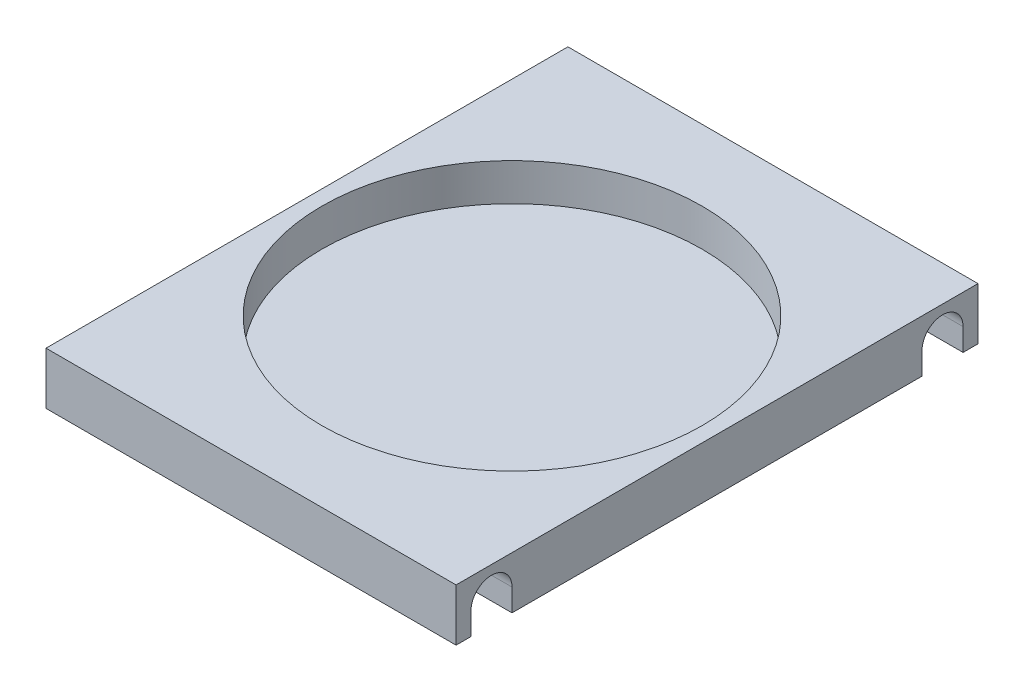
ISO-10303-21;
HEADER;
FILE_DESCRIPTION(('STEP AP214'),'2;1');
FILE_NAME('part.step','',(''),(''),'','','');
FILE_SCHEMA(('AUTOMOTIVE_DESIGN { 1 0 10303 214 1 1 1 1 }'));
ENDSEC;
DATA;
#1=APPLICATION_CONTEXT('core data for automotive mechanical design processes');
#2=APPLICATION_PROTOCOL_DEFINITION('international standard','automotive_design',2000,#1);
#3=PRODUCT_CONTEXT('',#1,'mechanical');
#4=PRODUCT('Part','Part','',(#3));
#5=PRODUCT_RELATED_PRODUCT_CATEGORY('part','',(#4));
#6=PRODUCT_DEFINITION_FORMATION('','',#4);
#7=PRODUCT_DEFINITION_CONTEXT('part definition',#1,'design');
#8=PRODUCT_DEFINITION('design','',#6,#7);
#9=PRODUCT_DEFINITION_SHAPE('','',#8);
#10=(LENGTH_UNIT() NAMED_UNIT(*) SI_UNIT(.MILLI.,.METRE.));
#11=(NAMED_UNIT(*) PLANE_ANGLE_UNIT() SI_UNIT($,.RADIAN.));
#12=(NAMED_UNIT(*) SI_UNIT($,.STERADIAN.) SOLID_ANGLE_UNIT());
#13=UNCERTAINTY_MEASURE_WITH_UNIT(LENGTH_MEASURE(1.E-05),#10,'distance_accuracy_value','');
#14=(GEOMETRIC_REPRESENTATION_CONTEXT(3) GLOBAL_UNCERTAINTY_ASSIGNED_CONTEXT((#13)) GLOBAL_UNIT_ASSIGNED_CONTEXT((#10,
#11,#12)) REPRESENTATION_CONTEXT('',''));
#15=CARTESIAN_POINT('',(0.,0.,0.));
#16=DIRECTION('',(0.,0.,1.));
#17=DIRECTION('',(1.,0.,0.));
#18=AXIS2_PLACEMENT_3D('',#15,#16,#17);
#19=CARTESIAN_POINT('',(27.5,8.,-35.));
#20=DIRECTION('',(-1.,0.,0.));
#21=DIRECTION('',(0.,0.,1.));
#22=AXIS2_PLACEMENT_3D('',#19,#20,#21);
#23=PLANE('',#22);
#24=DIRECTION('',(0.,-1.,0.));
#25=VECTOR('',#24,1.);
#26=CARTESIAN_POINT('',(27.5,8.,35.));
#27=LINE('',#26,#25);
#28=CARTESIAN_POINT('',(27.5,8.,35.));
#29=VERTEX_POINT('',#28);
#30=CARTESIAN_POINT('',(27.5,1.,35.));
#31=VERTEX_POINT('',#30);
#32=EDGE_CURVE('E240',#29,#31,#27,.T.);
#33=ORIENTED_EDGE('',*,*,#32,.T.);
#34=DIRECTION('',(0.,0.,1.));
#35=VECTOR('',#34,1.);
#36=CARTESIAN_POINT('',(27.5,1.,35.));
#37=LINE('',#36,#35);
#38=CARTESIAN_POINT('',(27.5,1.,33.));
#39=VERTEX_POINT('',#38);
#40=EDGE_CURVE('E152',#39,#31,#37,.T.);
#41=ORIENTED_EDGE('',*,*,#40,.F.);
#42=DIRECTION('',(0.,-1.,0.));
#43=VECTOR('',#42,1.);
#44=CARTESIAN_POINT('',(27.5,0.,33.));
#45=LINE('',#44,#43);
#46=CARTESIAN_POINT('',(27.5,4.,33.));
#47=VERTEX_POINT('',#46);
#48=EDGE_CURVE('E203',#47,#39,#45,.T.);
#49=ORIENTED_EDGE('',*,*,#48,.F.);
#50=CARTESIAN_POINT('',(27.5,4.,30.25));
#51=DIRECTION('',(1.,0.,0.));
#52=DIRECTION('',(0.,0.,-1.));
#53=AXIS2_PLACEMENT_3D('',#50,#51,#52);
#54=CIRCLE('',#53,2.75);
#55=CARTESIAN_POINT('',(27.5,4.,27.5));
#56=VERTEX_POINT('',#55);
#57=EDGE_CURVE('E199',#56,#47,#54,.T.);
#58=ORIENTED_EDGE('',*,*,#57,.F.);
#59=DIRECTION('',(0.,-1.,0.));
#60=VECTOR('',#59,1.);
#61=CARTESIAN_POINT('',(27.5,0.,27.5));
#62=LINE('',#61,#60);
#63=CARTESIAN_POINT('',(27.5,1.,27.5));
#64=VERTEX_POINT('',#63);
#65=EDGE_CURVE('E192',#56,#64,#62,.T.);
#66=ORIENTED_EDGE('',*,*,#65,.T.);
#67=CARTESIAN_POINT('',(27.5,1.,-27.5));
#68=VERTEX_POINT('',#67);
#69=EDGE_CURVE('E150',#68,#64,#37,.T.);
#70=ORIENTED_EDGE('',*,*,#69,.F.);
#71=DIRECTION('',(0.,-1.,0.));
#72=VECTOR('',#71,1.);
#73=CARTESIAN_POINT('',(27.5,0.,-27.5));
#74=LINE('',#73,#72);
#75=CARTESIAN_POINT('',(27.5,4.,-27.5));
#76=VERTEX_POINT('',#75);
#77=EDGE_CURVE('E252',#76,#68,#74,.T.);
#78=ORIENTED_EDGE('',*,*,#77,.F.);
#79=CARTESIAN_POINT('',(27.5,4.,-30.25));
#80=DIRECTION('',(-1.,0.,0.));
#81=DIRECTION('',(0.,0.,1.));
#82=AXIS2_PLACEMENT_3D('',#79,#80,#81);
#83=CIRCLE('',#82,2.75);
#84=CARTESIAN_POINT('',(27.5,4.,-33.));
#85=VERTEX_POINT('',#84);
#86=EDGE_CURVE('E184',#76,#85,#83,.T.);
#87=ORIENTED_EDGE('',*,*,#86,.T.);
#88=DIRECTION('',(0.,-1.,0.));
#89=VECTOR('',#88,1.);
#90=CARTESIAN_POINT('',(27.5,0.,-33.));
#91=LINE('',#90,#89);
#92=CARTESIAN_POINT('',(27.5,1.,-33.));
#93=VERTEX_POINT('',#92);
#94=EDGE_CURVE('E148',#85,#93,#91,.T.);
#95=ORIENTED_EDGE('',*,*,#94,.T.);
#96=CARTESIAN_POINT('',(27.5,1.,-35.));
#97=VERTEX_POINT('',#96);
#98=EDGE_CURVE('E129',#97,#93,#37,.T.);
#99=ORIENTED_EDGE('',*,*,#98,.F.);
#100=DIRECTION('',(0.,-1.,0.));
#101=VECTOR('',#100,1.);
#102=CARTESIAN_POINT('',(27.5,8.,-35.));
#103=LINE('',#102,#101);
#104=CARTESIAN_POINT('',(27.5,8.,-35.));
#105=VERTEX_POINT('',#104);
#106=EDGE_CURVE('E145',#105,#97,#103,.T.);
#107=ORIENTED_EDGE('',*,*,#106,.F.);
#108=DIRECTION('',(0.,0.,-1.));
#109=VECTOR('',#108,1.);
#110=CARTESIAN_POINT('',(27.5,8.,-35.));
#111=LINE('',#110,#109);
#112=EDGE_CURVE('E226',#29,#105,#111,.T.);
#113=ORIENTED_EDGE('',*,*,#112,.F.);
#114=EDGE_LOOP('',(#33,#41,#49,#58,#66,#70,#78,#87,#95,#99,#107,#113));
#115=FACE_BOUND('',#114,.T.);
#116=ADVANCED_FACE('F39',(#115),#23,.F.);
#117=CARTESIAN_POINT('',(-27.5,8.,-35.));
#118=DIRECTION('',(1.,0.,0.));
#119=DIRECTION('',(0.,0.,-1.));
#120=AXIS2_PLACEMENT_3D('',#117,#118,#119);
#121=PLANE('',#120);
#122=DIRECTION('',(0.,-1.,0.));
#123=VECTOR('',#122,1.);
#124=CARTESIAN_POINT('',(-27.5,8.,-35.));
#125=LINE('',#124,#123);
#126=CARTESIAN_POINT('',(-27.5,8.,-35.));
#127=VERTEX_POINT('',#126);
#128=CARTESIAN_POINT('',(-27.5,1.,-35.));
#129=VERTEX_POINT('',#128);
#130=EDGE_CURVE('E158',#127,#129,#125,.T.);
#131=ORIENTED_EDGE('',*,*,#130,.T.);
#132=DIRECTION('',(0.,0.,1.));
#133=VECTOR('',#132,1.);
#134=CARTESIAN_POINT('',(-27.5,1.,-35.));
#135=LINE('',#134,#133);
#136=CARTESIAN_POINT('',(-27.5,1.,-33.));
#137=VERTEX_POINT('',#136);
#138=EDGE_CURVE('E132',#129,#137,#135,.T.);
#139=ORIENTED_EDGE('',*,*,#138,.T.);
#140=DIRECTION('',(0.,-1.,0.));
#141=VECTOR('',#140,1.);
#142=CARTESIAN_POINT('',(-27.5,8.,-33.));
#143=LINE('',#142,#141);
#144=CARTESIAN_POINT('',(-27.5,4.,-33.));
#145=VERTEX_POINT('',#144);
#146=EDGE_CURVE('E182',#145,#137,#143,.T.);
#147=ORIENTED_EDGE('',*,*,#146,.F.);
#148=CARTESIAN_POINT('',(-27.5,4.,-30.25));
#149=DIRECTION('',(1.,0.,0.));
#150=DIRECTION('',(0.,0.,-1.));
#151=AXIS2_PLACEMENT_3D('',#148,#149,#150);
#152=CIRCLE('',#151,2.75);
#153=CARTESIAN_POINT('',(-27.5,4.,-27.5));
#154=VERTEX_POINT('',#153);
#155=EDGE_CURVE('E47',#154,#145,#152,.F.);
#156=ORIENTED_EDGE('',*,*,#155,.F.);
#157=DIRECTION('',(0.,-1.,0.));
#158=VECTOR('',#157,1.);
#159=CARTESIAN_POINT('',(-27.5,8.,-27.5));
#160=LINE('',#159,#158);
#161=CARTESIAN_POINT('',(-27.5,1.,-27.5));
#162=VERTEX_POINT('',#161);
#163=EDGE_CURVE('E188',#154,#162,#160,.T.);
#164=ORIENTED_EDGE('',*,*,#163,.T.);
#165=CARTESIAN_POINT('',(-27.5,1.,27.5));
#166=VERTEX_POINT('',#165);
#167=EDGE_CURVE('E62',#162,#166,#135,.T.);
#168=ORIENTED_EDGE('',*,*,#167,.T.);
#169=DIRECTION('',(0.,-1.,0.));
#170=VECTOR('',#169,1.);
#171=CARTESIAN_POINT('',(-27.5,8.,27.5));
#172=LINE('',#171,#170);
#173=CARTESIAN_POINT('',(-27.5,4.,27.5));
#174=VERTEX_POINT('',#173);
#175=EDGE_CURVE('E217',#174,#166,#172,.T.);
#176=ORIENTED_EDGE('',*,*,#175,.F.);
#177=CARTESIAN_POINT('',(-27.5,4.,30.25));
#178=DIRECTION('',(1.,0.,0.));
#179=DIRECTION('',(0.,0.,-1.));
#180=AXIS2_PLACEMENT_3D('',#177,#178,#179);
#181=CIRCLE('',#180,2.75);
#182=CARTESIAN_POINT('',(-27.5,4.,33.));
#183=VERTEX_POINT('',#182);
#184=EDGE_CURVE('E157',#174,#183,#181,.T.);
#185=ORIENTED_EDGE('',*,*,#184,.T.);
#186=DIRECTION('',(0.,-1.,0.));
#187=VECTOR('',#186,1.);
#188=CARTESIAN_POINT('',(-27.5,8.,33.));
#189=LINE('',#188,#187);
#190=CARTESIAN_POINT('',(-27.5,1.,33.));
#191=VERTEX_POINT('',#190);
#192=EDGE_CURVE('E211',#183,#191,#189,.T.);
#193=ORIENTED_EDGE('',*,*,#192,.T.);
#194=CARTESIAN_POINT('',(-27.5,1.,35.));
#195=VERTEX_POINT('',#194);
#196=EDGE_CURVE('E54',#191,#195,#135,.T.);
#197=ORIENTED_EDGE('',*,*,#196,.T.);
#198=DIRECTION('',(0.,-1.,0.));
#199=VECTOR('',#198,1.);
#200=CARTESIAN_POINT('',(-27.5,8.,35.));
#201=LINE('',#200,#199);
#202=CARTESIAN_POINT('',(-27.5,8.,35.));
#203=VERTEX_POINT('',#202);
#204=EDGE_CURVE('E164',#203,#195,#201,.T.);
#205=ORIENTED_EDGE('',*,*,#204,.F.);
#206=DIRECTION('',(0.,0.,1.));
#207=VECTOR('',#206,1.);
#208=CARTESIAN_POINT('',(-27.5,8.,-35.));
#209=LINE('',#208,#207);
#210=EDGE_CURVE('E234',#127,#203,#209,.T.);
#211=ORIENTED_EDGE('',*,*,#210,.F.);
#212=EDGE_LOOP('',(#131,#139,#147,#156,#164,#168,#176,#185,#193,#197,#205,#211));
#213=FACE_BOUND('',#212,.T.);
#214=ADVANCED_FACE('F186',(#213),#121,.F.);
#215=CARTESIAN_POINT('',(-27.5,8.,-35.));
#216=DIRECTION('',(0.,0.,1.));
#217=DIRECTION('',(1.,0.,0.));
#218=AXIS2_PLACEMENT_3D('',#215,#216,#217);
#219=PLANE('',#218);
#220=ORIENTED_EDGE('',*,*,#106,.T.);
#221=DIRECTION('',(1.,0.,0.));
#222=VECTOR('',#221,1.);
#223=CARTESIAN_POINT('',(-97.5,1.,-35.));
#224=LINE('',#223,#222);
#225=EDGE_CURVE('E126',#129,#97,#224,.T.);
#226=ORIENTED_EDGE('',*,*,#225,.F.);
#227=ORIENTED_EDGE('',*,*,#130,.F.);
#228=DIRECTION('',(-1.,0.,0.));
#229=VECTOR('',#228,1.);
#230=CARTESIAN_POINT('',(-27.5,8.,-35.));
#231=LINE('',#230,#229);
#232=EDGE_CURVE('E154',#105,#127,#231,.T.);
#233=ORIENTED_EDGE('',*,*,#232,.F.);
#234=EDGE_LOOP('',(#220,#226,#227,#233));
#235=FACE_BOUND('',#234,.T.);
#236=ADVANCED_FACE('F153',(#235),#219,.F.);
#237=CARTESIAN_POINT('',(-27.5,8.,35.));
#238=DIRECTION('',(0.,0.,-1.));
#239=DIRECTION('',(-1.,0.,0.));
#240=AXIS2_PLACEMENT_3D('',#237,#238,#239);
#241=PLANE('',#240);
#242=ORIENTED_EDGE('',*,*,#204,.T.);
#243=DIRECTION('',(1.,0.,0.));
#244=VECTOR('',#243,1.);
#245=CARTESIAN_POINT('',(-97.5,1.,35.));
#246=LINE('',#245,#244);
#247=EDGE_CURVE('E138',#195,#31,#246,.T.);
#248=ORIENTED_EDGE('',*,*,#247,.T.);
#249=ORIENTED_EDGE('',*,*,#32,.F.);
#250=DIRECTION('',(1.,0.,0.));
#251=VECTOR('',#250,1.);
#252=CARTESIAN_POINT('',(-27.5,8.,35.));
#253=LINE('',#252,#251);
#254=EDGE_CURVE('E237',#203,#29,#253,.T.);
#255=ORIENTED_EDGE('',*,*,#254,.F.);
#256=EDGE_LOOP('',(#242,#248,#249,#255));
#257=FACE_BOUND('',#256,.T.);
#258=ADVANCED_FACE('F248',(#257),#241,.F.);
#259=CARTESIAN_POINT('',(0.,8.,0.));
#260=DIRECTION('',(0.,1.,0.));
#261=DIRECTION('',(0.,0.,1.));
#262=AXIS2_PLACEMENT_3D('',#259,#260,#261);
#263=PLANE('',#262);
#264=CARTESIAN_POINT('',(0.,8.,0.));
#265=DIRECTION('',(0.,1.,0.));
#266=DIRECTION('',(0.,0.,1.));
#267=AXIS2_PLACEMENT_3D('',#264,#265,#266);
#268=CIRCLE('',#267,25.5);
#269=CARTESIAN_POINT('',(0.,8.,25.5));
#270=VERTEX_POINT('',#269);
#271=EDGE_CURVE('E221',#270,#270,#268,.T.);
#272=ORIENTED_EDGE('',*,*,#271,.F.);
#273=EDGE_LOOP('',(#272));
#274=FACE_BOUND('',#273,.T.);
#275=ORIENTED_EDGE('',*,*,#112,.T.);
#276=ORIENTED_EDGE('',*,*,#232,.T.);
#277=ORIENTED_EDGE('',*,*,#210,.T.);
#278=ORIENTED_EDGE('',*,*,#254,.T.);
#279=EDGE_LOOP('',(#275,#276,#277,#278));
#280=FACE_BOUND('',#279,.T.);
#281=ADVANCED_FACE('F314',(#274,#280),#263,.T.);
#282=CARTESIAN_POINT('',(0.,3.,0.));
#283=DIRECTION('',(0.,1.,0.));
#284=DIRECTION('',(0.,0.,1.));
#285=AXIS2_PLACEMENT_3D('',#282,#283,#284);
#286=CYLINDRICAL_SURFACE('',#285,25.5);
#287=CARTESIAN_POINT('',(0.,3.,0.));
#288=DIRECTION('',(0.,1.,0.));
#289=DIRECTION('',(0.,0.,1.));
#290=AXIS2_PLACEMENT_3D('',#287,#288,#289);
#291=CIRCLE('',#290,25.5);
#292=CARTESIAN_POINT('',(0.,3.,25.5));
#293=VERTEX_POINT('',#292);
#294=EDGE_CURVE('E222',#293,#293,#291,.T.);
#295=ORIENTED_EDGE('',*,*,#294,.F.);
#296=EDGE_LOOP('',(#295));
#297=FACE_BOUND('',#296,.T.);
#298=ORIENTED_EDGE('',*,*,#271,.T.);
#299=EDGE_LOOP('',(#298));
#300=FACE_BOUND('',#299,.T.);
#301=ADVANCED_FACE('F317',(#297,#300),#286,.F.);
#302=CARTESIAN_POINT('',(0.,3.,0.));
#303=DIRECTION('',(0.,1.,0.));
#304=DIRECTION('',(0.,0.,1.));
#305=AXIS2_PLACEMENT_3D('',#302,#303,#304);
#306=PLANE('',#305);
#307=ORIENTED_EDGE('',*,*,#294,.T.);
#308=EDGE_LOOP('',(#307));
#309=FACE_BOUND('',#308,.T.);
#310=ADVANCED_FACE('F321',(#309),#306,.T.);
#311=CARTESIAN_POINT('',(-97.5,4.,30.25));
#312=DIRECTION('',(1.,0.,0.));
#313=DIRECTION('',(0.,0.,-1.));
#314=AXIS2_PLACEMENT_3D('',#311,#312,#313);
#315=CYLINDRICAL_SURFACE('',#314,2.75);
#316=DIRECTION('',(1.,0.,0.));
#317=VECTOR('',#316,1.);
#318=CARTESIAN_POINT('',(-97.5,4.,27.5));
#319=LINE('',#318,#317);
#320=EDGE_CURVE('E207',#174,#56,#319,.T.);
#321=ORIENTED_EDGE('',*,*,#320,.T.);
#322=ORIENTED_EDGE('',*,*,#57,.T.);
#323=DIRECTION('',(1.,0.,0.));
#324=VECTOR('',#323,1.);
#325=CARTESIAN_POINT('',(-97.5,4.,33.));
#326=LINE('',#325,#324);
#327=EDGE_CURVE('E208',#183,#47,#326,.T.);
#328=ORIENTED_EDGE('',*,*,#327,.F.);
#329=ORIENTED_EDGE('',*,*,#184,.F.);
#330=EDGE_LOOP('',(#321,#322,#328,#329));
#331=FACE_BOUND('',#330,.T.);
#332=ADVANCED_FACE('F278',(#331),#315,.F.);
#333=CARTESIAN_POINT('',(-97.5,0.,27.5));
#334=DIRECTION('',(0.,0.,1.));
#335=DIRECTION('',(1.,0.,0.));
#336=AXIS2_PLACEMENT_3D('',#333,#334,#335);
#337=PLANE('',#336);
#338=DIRECTION('',(-1.,0.,0.));
#339=VECTOR('',#338,1.);
#340=CARTESIAN_POINT('',(-97.5,1.,27.5));
#341=LINE('',#340,#339);
#342=EDGE_CURVE('E259',#64,#166,#341,.T.);
#343=ORIENTED_EDGE('',*,*,#342,.F.);
#344=ORIENTED_EDGE('',*,*,#65,.F.);
#345=ORIENTED_EDGE('',*,*,#320,.F.);
#346=ORIENTED_EDGE('',*,*,#175,.T.);
#347=EDGE_LOOP('',(#343,#344,#345,#346));
#348=FACE_BOUND('',#347,.T.);
#349=ADVANCED_FACE('F285',(#348),#337,.T.);
#350=CARTESIAN_POINT('',(-97.5,0.,33.));
#351=DIRECTION('',(0.,0.,1.));
#352=DIRECTION('',(1.,0.,0.));
#353=AXIS2_PLACEMENT_3D('',#350,#351,#352);
#354=PLANE('',#353);
#355=ORIENTED_EDGE('',*,*,#48,.T.);
#356=DIRECTION('',(-1.,0.,0.));
#357=VECTOR('',#356,1.);
#358=CARTESIAN_POINT('',(-97.5,1.,33.));
#359=LINE('',#358,#357);
#360=EDGE_CURVE('E253',#39,#191,#359,.T.);
#361=ORIENTED_EDGE('',*,*,#360,.T.);
#362=ORIENTED_EDGE('',*,*,#192,.F.);
#363=ORIENTED_EDGE('',*,*,#327,.T.);
#364=EDGE_LOOP('',(#355,#361,#362,#363));
#365=FACE_BOUND('',#364,.T.);
#366=ADVANCED_FACE('F275',(#365),#354,.F.);
#367=CARTESIAN_POINT('',(-97.5,4.,-30.25));
#368=DIRECTION('',(1.,0.,0.));
#369=DIRECTION('',(0.,0.,-1.));
#370=AXIS2_PLACEMENT_3D('',#367,#368,#369);
#371=CYLINDRICAL_SURFACE('',#370,2.75);
#372=ORIENTED_EDGE('',*,*,#155,.T.);
#373=DIRECTION('',(1.,0.,0.));
#374=VECTOR('',#373,1.);
#375=CARTESIAN_POINT('',(-97.5,4.,-33.));
#376=LINE('',#375,#374);
#377=EDGE_CURVE('E174',#145,#85,#376,.T.);
#378=ORIENTED_EDGE('',*,*,#377,.T.);
#379=ORIENTED_EDGE('',*,*,#86,.F.);
#380=DIRECTION('',(1.,0.,0.));
#381=VECTOR('',#380,1.);
#382=CARTESIAN_POINT('',(-97.5,4.,-27.5));
#383=LINE('',#382,#381);
#384=EDGE_CURVE('E175',#154,#76,#383,.T.);
#385=ORIENTED_EDGE('',*,*,#384,.F.);
#386=EDGE_LOOP('',(#372,#378,#379,#385));
#387=FACE_BOUND('',#386,.T.);
#388=ADVANCED_FACE('F172',(#387),#371,.F.);
#389=CARTESIAN_POINT('',(-97.5,0.,-27.5));
#390=DIRECTION('',(0.,0.,1.));
#391=DIRECTION('',(1.,0.,0.));
#392=AXIS2_PLACEMENT_3D('',#389,#390,#391);
#393=PLANE('',#392);
#394=ORIENTED_EDGE('',*,*,#77,.T.);
#395=DIRECTION('',(-1.,0.,0.));
#396=VECTOR('',#395,1.);
#397=CARTESIAN_POINT('',(-97.5,1.,-27.5));
#398=LINE('',#397,#396);
#399=EDGE_CURVE('E263',#68,#162,#398,.T.);
#400=ORIENTED_EDGE('',*,*,#399,.T.);
#401=ORIENTED_EDGE('',*,*,#163,.F.);
#402=ORIENTED_EDGE('',*,*,#384,.T.);
#403=EDGE_LOOP('',(#394,#400,#401,#402));
#404=FACE_BOUND('',#403,.T.);
#405=ADVANCED_FACE('F294',(#404),#393,.F.);
#406=CARTESIAN_POINT('',(-97.5,0.,-33.));
#407=DIRECTION('',(0.,0.,1.));
#408=DIRECTION('',(1.,0.,0.));
#409=AXIS2_PLACEMENT_3D('',#406,#407,#408);
#410=PLANE('',#409);
#411=DIRECTION('',(-1.,0.,0.));
#412=VECTOR('',#411,1.);
#413=CARTESIAN_POINT('',(-97.5,1.,-33.));
#414=LINE('',#413,#412);
#415=EDGE_CURVE('E11',#93,#137,#414,.T.);
#416=ORIENTED_EDGE('',*,*,#415,.F.);
#417=ORIENTED_EDGE('',*,*,#94,.F.);
#418=ORIENTED_EDGE('',*,*,#377,.F.);
#419=ORIENTED_EDGE('',*,*,#146,.T.);
#420=EDGE_LOOP('',(#416,#417,#418,#419));
#421=FACE_BOUND('',#420,.T.);
#422=ADVANCED_FACE('F181',(#421),#410,.T.);
#423=CARTESIAN_POINT('',(-97.5,1.,35.));
#424=DIRECTION('',(0.,1.,0.));
#425=DIRECTION('',(0.,0.,1.));
#426=AXIS2_PLACEMENT_3D('',#423,#424,#425);
#427=PLANE('',#426);
#428=ORIENTED_EDGE('',*,*,#225,.T.);
#429=ORIENTED_EDGE('',*,*,#98,.T.);
#430=ORIENTED_EDGE('',*,*,#415,.T.);
#431=ORIENTED_EDGE('',*,*,#138,.F.);
#432=EDGE_LOOP('',(#428,#429,#430,#431));
#433=FACE_BOUND('',#432,.T.);
#434=ADVANCED_FACE('F128',(#433),#427,.F.);
#435=ORIENTED_EDGE('',*,*,#342,.T.);
#436=ORIENTED_EDGE('',*,*,#167,.F.);
#437=ORIENTED_EDGE('',*,*,#399,.F.);
#438=ORIENTED_EDGE('',*,*,#69,.T.);
#439=EDGE_LOOP('',(#435,#436,#437,#438));
#440=FACE_BOUND('',#439,.T.);
#441=ADVANCED_FACE('F295',(#440),#427,.F.);
#442=ORIENTED_EDGE('',*,*,#360,.F.);
#443=ORIENTED_EDGE('',*,*,#40,.T.);
#444=ORIENTED_EDGE('',*,*,#247,.F.);
#445=ORIENTED_EDGE('',*,*,#196,.F.);
#446=EDGE_LOOP('',(#442,#443,#444,#445));
#447=FACE_BOUND('',#446,.T.);
#448=ADVANCED_FACE('F271',(#447),#427,.F.);
#449=CLOSED_SHELL('',(#116,#214,#236,#258,#281,#301,#310,#332,#349,#366,#388,#405,#422,#434,
#441,#448));
#450=MANIFOLD_SOLID_BREP('B2',#449);
#451=ADVANCED_BREP_SHAPE_REPRESENTATION('',(#18,#450),#14);
#452=SHAPE_DEFINITION_REPRESENTATION(#9,#451);
ENDSEC;
END-ISO-10303-21;
